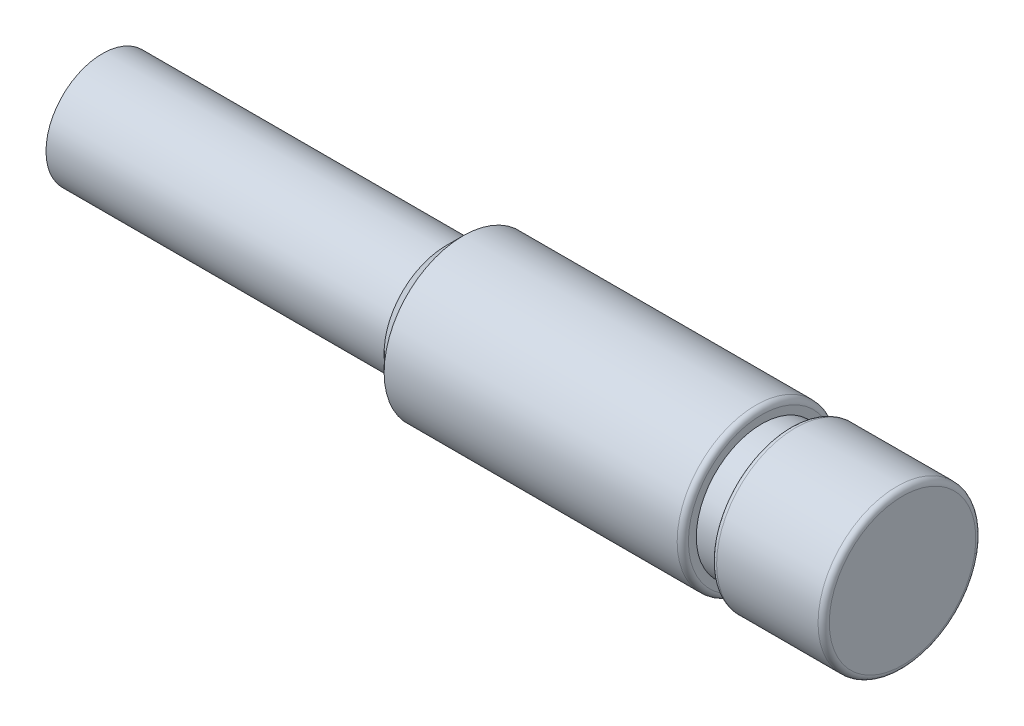
ISO-10303-21;
HEADER;
FILE_DESCRIPTION(('STEP AP214'),'2;1');
FILE_NAME('part.step','',(''),(''),'','','');
FILE_SCHEMA(('AUTOMOTIVE_DESIGN { 1 0 10303 214 1 1 1 1 }'));
ENDSEC;
DATA;
#1=APPLICATION_CONTEXT('core data for automotive mechanical design processes');
#2=APPLICATION_PROTOCOL_DEFINITION('international standard','automotive_design',2000,#1);
#3=PRODUCT_CONTEXT('',#1,'mechanical');
#4=PRODUCT('Part','Part','',(#3));
#5=PRODUCT_RELATED_PRODUCT_CATEGORY('part','',(#4));
#6=PRODUCT_DEFINITION_FORMATION('','',#4);
#7=PRODUCT_DEFINITION_CONTEXT('part definition',#1,'design');
#8=PRODUCT_DEFINITION('design','',#6,#7);
#9=PRODUCT_DEFINITION_SHAPE('','',#8);
#10=(LENGTH_UNIT() NAMED_UNIT(*) SI_UNIT(.MILLI.,.METRE.));
#11=(NAMED_UNIT(*) PLANE_ANGLE_UNIT() SI_UNIT($,.RADIAN.));
#12=(NAMED_UNIT(*) SI_UNIT($,.STERADIAN.) SOLID_ANGLE_UNIT());
#13=UNCERTAINTY_MEASURE_WITH_UNIT(LENGTH_MEASURE(1.E-05),#10,'distance_accuracy_value','');
#14=(GEOMETRIC_REPRESENTATION_CONTEXT(3) GLOBAL_UNCERTAINTY_ASSIGNED_CONTEXT((#13)) GLOBAL_UNIT_ASSIGNED_CONTEXT((#10,
#11,#12)) REPRESENTATION_CONTEXT('',''));
#15=CARTESIAN_POINT('',(0.,0.,0.));
#16=DIRECTION('',(0.,0.,1.));
#17=DIRECTION('',(1.,0.,0.));
#18=AXIS2_PLACEMENT_3D('',#15,#16,#17);
#19=CARTESIAN_POINT('',(0.,5.,0.));
#20=DIRECTION('',(1.,0.,0.));
#21=DIRECTION('',(0.,0.,-1.));
#22=AXIS2_PLACEMENT_3D('',#19,#20,#21);
#23=PLANE('',#22);
#24=CARTESIAN_POINT('',(0.,0.,0.));
#25=DIRECTION('',(1.,0.,0.));
#26=DIRECTION('',(0.,0.,-1.));
#27=AXIS2_PLACEMENT_3D('',#24,#25,#26);
#28=CIRCLE('',#27,4.50000000000001);
#29=CARTESIAN_POINT('',(0.,0.,-4.50000000000001));
#30=VERTEX_POINT('',#29);
#31=EDGE_CURVE('E66',#30,#30,#28,.T.);
#32=ORIENTED_EDGE('',*,*,#31,.T.);
#33=EDGE_LOOP('',(#32));
#34=FACE_BOUND('',#33,.T.);
#35=CARTESIAN_POINT('',(0.,0.,0.));
#36=DIRECTION('',(-1.,0.,0.));
#37=DIRECTION('',(0.,0.,1.));
#38=AXIS2_PLACEMENT_3D('',#35,#36,#37);
#39=CIRCLE('',#38,5.);
#40=CARTESIAN_POINT('',(0.,0.,5.));
#41=VERTEX_POINT('',#40);
#42=EDGE_CURVE('E81',#41,#41,#39,.T.);
#43=ORIENTED_EDGE('',*,*,#42,.T.);
#44=EDGE_LOOP('',(#43));
#45=FACE_BOUND('',#44,.T.);
#46=ADVANCED_FACE('F34',(#34,#45),#23,.F.);
#47=CARTESIAN_POINT('',(71.,0.,0.));
#48=DIRECTION('',(-1.,0.,0.));
#49=DIRECTION('',(0.,0.,1.));
#50=AXIS2_PLACEMENT_3D('',#47,#48,#49);
#51=PLANE('',#50);
#52=CARTESIAN_POINT('',(71.,0.,0.));
#53=DIRECTION('',(-1.,0.,0.));
#54=DIRECTION('',(0.,0.,1.));
#55=AXIS2_PLACEMENT_3D('',#52,#53,#54);
#56=CIRCLE('',#55,6.5);
#57=CARTESIAN_POINT('',(71.,0.,6.5));
#58=VERTEX_POINT('',#57);
#59=EDGE_CURVE('E41',#58,#58,#56,.F.);
#60=ORIENTED_EDGE('',*,*,#59,.T.);
#61=EDGE_LOOP('',(#60));
#62=FACE_BOUND('',#61,.T.);
#63=ADVANCED_FACE('F105',(#62),#51,.F.);
#64=CARTESIAN_POINT('',(0.,0.,0.));
#65=DIRECTION('',(-1.,0.,0.));
#66=DIRECTION('',(0.,0.,1.));
#67=AXIS2_PLACEMENT_3D('',#64,#65,#66);
#68=CYLINDRICAL_SURFACE('',#67,7.);
#69=CARTESIAN_POINT('',(70.5,0.,0.));
#70=DIRECTION('',(-1.,0.,0.));
#71=DIRECTION('',(0.,0.,1.));
#72=AXIS2_PLACEMENT_3D('',#69,#70,#71);
#73=CIRCLE('',#72,7.);
#74=CARTESIAN_POINT('',(70.5,0.,7.));
#75=VERTEX_POINT('',#74);
#76=EDGE_CURVE('E45',#75,#75,#73,.T.);
#77=ORIENTED_EDGE('',*,*,#76,.T.);
#78=EDGE_LOOP('',(#77));
#79=FACE_BOUND('',#78,.T.);
#80=CARTESIAN_POINT('',(61.5,0.,0.));
#81=DIRECTION('',(1.,0.,0.));
#82=DIRECTION('',(0.,0.,-1.));
#83=AXIS2_PLACEMENT_3D('',#80,#81,#82);
#84=CIRCLE('',#83,7.);
#85=CARTESIAN_POINT('',(61.5,0.,-7.));
#86=VERTEX_POINT('',#85);
#87=EDGE_CURVE('E49',#86,#86,#84,.T.);
#88=ORIENTED_EDGE('',*,*,#87,.T.);
#89=EDGE_LOOP('',(#88));
#90=FACE_BOUND('',#89,.T.);
#91=ADVANCED_FACE('F111',(#79,#90),#68,.T.);
#92=CARTESIAN_POINT('',(61.,7.,0.));
#93=DIRECTION('',(1.,0.,0.));
#94=DIRECTION('',(0.,0.,-1.));
#95=AXIS2_PLACEMENT_3D('',#92,#93,#94);
#96=PLANE('',#95);
#97=CARTESIAN_POINT('',(61.,0.,0.));
#98=DIRECTION('',(1.,0.,0.));
#99=DIRECTION('',(0.,0.,-1.));
#100=AXIS2_PLACEMENT_3D('',#97,#98,#99);
#101=CIRCLE('',#100,6.5);
#102=CARTESIAN_POINT('',(61.,0.,-6.5));
#103=VERTEX_POINT('',#102);
#104=EDGE_CURVE('E10',#103,#103,#101,.F.);
#105=ORIENTED_EDGE('',*,*,#104,.T.);
#106=EDGE_LOOP('',(#105));
#107=FACE_BOUND('',#106,.T.);
#108=CARTESIAN_POINT('',(61.,0.,0.));
#109=DIRECTION('',(-1.,0.,0.));
#110=DIRECTION('',(0.,0.,1.));
#111=AXIS2_PLACEMENT_3D('',#108,#109,#110);
#112=CIRCLE('',#111,5.8);
#113=CARTESIAN_POINT('',(61.,0.,5.8));
#114=VERTEX_POINT('',#113);
#115=EDGE_CURVE('E72',#114,#114,#112,.T.);
#116=ORIENTED_EDGE('',*,*,#115,.F.);
#117=EDGE_LOOP('',(#116));
#118=FACE_BOUND('',#117,.T.);
#119=ADVANCED_FACE('F138',(#107,#118),#96,.F.);
#120=CARTESIAN_POINT('',(0.,0.,0.));
#121=DIRECTION('',(-1.,0.,0.));
#122=DIRECTION('',(0.,0.,1.));
#123=AXIS2_PLACEMENT_3D('',#120,#121,#122);
#124=CYLINDRICAL_SURFACE('',#123,5.8);
#125=CARTESIAN_POINT('',(58.5,0.,0.));
#126=DIRECTION('',(-1.,0.,0.));
#127=DIRECTION('',(0.,0.,1.));
#128=AXIS2_PLACEMENT_3D('',#125,#126,#127);
#129=CIRCLE('',#128,5.8);
#130=CARTESIAN_POINT('',(58.5,0.,5.8));
#131=VERTEX_POINT('',#130);
#132=EDGE_CURVE('E75',#131,#131,#129,.T.);
#133=ORIENTED_EDGE('',*,*,#132,.F.);
#134=EDGE_LOOP('',(#133));
#135=FACE_BOUND('',#134,.T.);
#136=ORIENTED_EDGE('',*,*,#115,.T.);
#137=EDGE_LOOP('',(#136));
#138=FACE_BOUND('',#137,.T.);
#139=ADVANCED_FACE('F144',(#135,#138),#124,.T.);
#140=CARTESIAN_POINT('',(58.5,5.8,0.));
#141=DIRECTION('',(-1.,0.,0.));
#142=DIRECTION('',(0.,0.,1.));
#143=AXIS2_PLACEMENT_3D('',#140,#141,#142);
#144=PLANE('',#143);
#145=CARTESIAN_POINT('',(58.5,0.,0.));
#146=DIRECTION('',(-1.,0.,0.));
#147=DIRECTION('',(0.,0.,1.));
#148=AXIS2_PLACEMENT_3D('',#145,#146,#147);
#149=CIRCLE('',#148,6.49999999999999);
#150=CARTESIAN_POINT('',(58.5,0.,6.49999999999999));
#151=VERTEX_POINT('',#150);
#152=EDGE_CURVE('E54',#151,#151,#149,.F.);
#153=ORIENTED_EDGE('',*,*,#152,.T.);
#154=EDGE_LOOP('',(#153));
#155=FACE_BOUND('',#154,.T.);
#156=ORIENTED_EDGE('',*,*,#132,.T.);
#157=EDGE_LOOP('',(#156));
#158=FACE_BOUND('',#157,.T.);
#159=ADVANCED_FACE('F149',(#155,#158),#144,.F.);
#160=CARTESIAN_POINT('',(0.,0.,0.));
#161=DIRECTION('',(-1.,0.,0.));
#162=DIRECTION('',(0.,0.,1.));
#163=AXIS2_PLACEMENT_3D('',#160,#161,#162);
#164=CYLINDRICAL_SURFACE('',#163,6.99999999999999);
#165=CARTESIAN_POINT('',(58.,0.,0.));
#166=DIRECTION('',(-1.,0.,0.));
#167=DIRECTION('',(0.,0.,1.));
#168=AXIS2_PLACEMENT_3D('',#165,#166,#167);
#169=CIRCLE('',#168,6.99999999999999);
#170=CARTESIAN_POINT('',(58.,0.,6.99999999999999));
#171=VERTEX_POINT('',#170);
#172=EDGE_CURVE('E57',#171,#171,#169,.T.);
#173=ORIENTED_EDGE('',*,*,#172,.T.);
#174=EDGE_LOOP('',(#173));
#175=FACE_BOUND('',#174,.T.);
#176=CARTESIAN_POINT('',(32.,0.,0.));
#177=DIRECTION('',(1.,0.,0.));
#178=DIRECTION('',(0.,0.,-1.));
#179=AXIS2_PLACEMENT_3D('',#176,#177,#178);
#180=CIRCLE('',#179,6.99999999999999);
#181=CARTESIAN_POINT('',(32.,0.,-6.99999999999999));
#182=VERTEX_POINT('',#181);
#183=EDGE_CURVE('E60',#182,#182,#180,.T.);
#184=ORIENTED_EDGE('',*,*,#183,.T.);
#185=EDGE_LOOP('',(#184));
#186=FACE_BOUND('',#185,.T.);
#187=ADVANCED_FACE('F153',(#175,#186),#164,.T.);
#188=CARTESIAN_POINT('',(30.5,6.99999999999999,0.));
#189=DIRECTION('',(1.,0.,0.));
#190=DIRECTION('',(0.,0.,-1.));
#191=AXIS2_PLACEMENT_3D('',#188,#189,#190);
#192=PLANE('',#191);
#193=CARTESIAN_POINT('',(30.5,0.,0.));
#194=DIRECTION('',(1.,0.,0.));
#195=DIRECTION('',(0.,0.,-1.));
#196=AXIS2_PLACEMENT_3D('',#193,#194,#195);
#197=CIRCLE('',#196,5.49999999999999);
#198=CARTESIAN_POINT('',(30.5,0.,-5.49999999999999));
#199=VERTEX_POINT('',#198);
#200=EDGE_CURVE('E63',#199,#199,#197,.F.);
#201=ORIENTED_EDGE('',*,*,#200,.T.);
#202=EDGE_LOOP('',(#201));
#203=FACE_BOUND('',#202,.T.);
#204=CARTESIAN_POINT('',(30.5,0.,0.));
#205=DIRECTION('',(-1.,0.,0.));
#206=DIRECTION('',(0.,0.,1.));
#207=AXIS2_PLACEMENT_3D('',#204,#205,#206);
#208=CIRCLE('',#207,5.);
#209=CARTESIAN_POINT('',(30.5,0.,5.));
#210=VERTEX_POINT('',#209);
#211=EDGE_CURVE('E78',#210,#210,#208,.T.);
#212=ORIENTED_EDGE('',*,*,#211,.F.);
#213=EDGE_LOOP('',(#212));
#214=FACE_BOUND('',#213,.T.);
#215=ADVANCED_FACE('F101',(#203,#214),#192,.F.);
#216=CARTESIAN_POINT('',(0.,0.,0.));
#217=DIRECTION('',(-1.,0.,0.));
#218=DIRECTION('',(0.,0.,1.));
#219=AXIS2_PLACEMENT_3D('',#216,#217,#218);
#220=CYLINDRICAL_SURFACE('',#219,5.);
#221=ORIENTED_EDGE('',*,*,#42,.F.);
#222=EDGE_LOOP('',(#221));
#223=FACE_BOUND('',#222,.T.);
#224=ORIENTED_EDGE('',*,*,#211,.T.);
#225=EDGE_LOOP('',(#224));
#226=FACE_BOUND('',#225,.T.);
#227=ADVANCED_FACE('F92',(#223,#226),#220,.T.);
#228=CARTESIAN_POINT('',(3.6,0.,0.));
#229=DIRECTION('',(-1.,0.,0.));
#230=DIRECTION('',(0.,0.,1.));
#231=AXIS2_PLACEMENT_3D('',#228,#229,#230);
#232=CYLINDRICAL_SURFACE('',#231,3.);
#233=CARTESIAN_POINT('',(3.21676038076436,0.,0.));
#234=DIRECTION('',(1.,0.,0.));
#235=DIRECTION('',(0.,0.,-1.));
#236=AXIS2_PLACEMENT_3D('',#233,#234,#235);
#237=CIRCLE('',#236,3.);
#238=CARTESIAN_POINT('',(3.21676038076436,0.,-3.));
#239=VERTEX_POINT('',#238);
#240=EDGE_CURVE('E69',#239,#239,#237,.F.);
#241=ORIENTED_EDGE('',*,*,#240,.T.);
#242=EDGE_LOOP('',(#241));
#243=FACE_BOUND('',#242,.T.);
#244=CARTESIAN_POINT('',(3.6,0.,0.));
#245=DIRECTION('',(-1.,0.,0.));
#246=DIRECTION('',(0.,0.,1.));
#247=AXIS2_PLACEMENT_3D('',#244,#245,#246);
#248=CIRCLE('',#247,3.);
#249=CARTESIAN_POINT('',(3.6,0.,3.));
#250=VERTEX_POINT('',#249);
#251=EDGE_CURVE('E84',#250,#250,#248,.T.);
#252=ORIENTED_EDGE('',*,*,#251,.F.);
#253=EDGE_LOOP('',(#252));
#254=FACE_BOUND('',#253,.T.);
#255=ADVANCED_FACE('F90',(#243,#254),#232,.F.);
#256=CARTESIAN_POINT('',(3.6,0.,0.));
#257=DIRECTION('',(-1.,0.,0.));
#258=DIRECTION('',(0.,0.,1.));
#259=AXIS2_PLACEMENT_3D('',#256,#257,#258);
#260=PLANE('',#259);
#261=ORIENTED_EDGE('',*,*,#251,.T.);
#262=EDGE_LOOP('',(#261));
#263=FACE_BOUND('',#262,.T.);
#264=ADVANCED_FACE('F88',(#263),#260,.T.);
#265=CARTESIAN_POINT('',(3.21676038076436,0.,0.));
#266=DIRECTION('',(-1.,0.,0.));
#267=DIRECTION('',(0.,0.,1.));
#268=AXIS2_PLACEMENT_3D('',#265,#266,#267);
#269=CONICAL_SURFACE('',#268,3.,0.436332312998583);
#270=ORIENTED_EDGE('',*,*,#31,.F.);
#271=EDGE_LOOP('',(#270));
#272=FACE_BOUND('',#271,.T.);
#273=ORIENTED_EDGE('',*,*,#240,.F.);
#274=EDGE_LOOP('',(#273));
#275=FACE_BOUND('',#274,.T.);
#276=ADVANCED_FACE('F99',(#272,#275),#269,.F.);
#277=CARTESIAN_POINT('',(30.5,0.,0.));
#278=DIRECTION('',(1.,0.,0.));
#279=DIRECTION('',(0.,0.,-1.));
#280=AXIS2_PLACEMENT_3D('',#277,#278,#279);
#281=CONICAL_SURFACE('',#280,5.49999999999999,0.78539816339745);
#282=ORIENTED_EDGE('',*,*,#183,.F.);
#283=EDGE_LOOP('',(#282));
#284=FACE_BOUND('',#283,.T.);
#285=ORIENTED_EDGE('',*,*,#200,.F.);
#286=EDGE_LOOP('',(#285));
#287=FACE_BOUND('',#286,.T.);
#288=ADVANCED_FACE('F118',(#284,#287),#281,.T.);
#289=CARTESIAN_POINT('',(58.,0.,0.));
#290=DIRECTION('',(-1.,0.,0.));
#291=DIRECTION('',(0.,0.,1.));
#292=AXIS2_PLACEMENT_3D('',#289,#290,#291);
#293=TOROIDAL_SURFACE('',#292,6.49999999999999,0.5);
#294=ORIENTED_EDGE('',*,*,#152,.F.);
#295=EDGE_LOOP('',(#294));
#296=FACE_BOUND('',#295,.T.);
#297=ORIENTED_EDGE('',*,*,#172,.F.);
#298=EDGE_LOOP('',(#297));
#299=FACE_BOUND('',#298,.T.);
#300=ADVANCED_FACE('F122',(#296,#299),#293,.T.);
#301=CARTESIAN_POINT('',(70.5,0.,0.));
#302=DIRECTION('',(-1.,0.,0.));
#303=DIRECTION('',(0.,0.,1.));
#304=AXIS2_PLACEMENT_3D('',#301,#302,#303);
#305=TOROIDAL_SURFACE('',#304,6.5,0.5);
#306=ORIENTED_EDGE('',*,*,#59,.F.);
#307=EDGE_LOOP('',(#306));
#308=FACE_BOUND('',#307,.T.);
#309=ORIENTED_EDGE('',*,*,#76,.F.);
#310=EDGE_LOOP('',(#309));
#311=FACE_BOUND('',#310,.T.);
#312=ADVANCED_FACE('F125',(#308,#311),#305,.T.);
#313=CARTESIAN_POINT('',(61.5,0.,0.));
#314=DIRECTION('',(1.,0.,0.));
#315=DIRECTION('',(0.,0.,-1.));
#316=AXIS2_PLACEMENT_3D('',#313,#314,#315);
#317=TOROIDAL_SURFACE('',#316,6.5,0.5);
#318=ORIENTED_EDGE('',*,*,#87,.F.);
#319=EDGE_LOOP('',(#318));
#320=FACE_BOUND('',#319,.T.);
#321=ORIENTED_EDGE('',*,*,#104,.F.);
#322=EDGE_LOOP('',(#321));
#323=FACE_BOUND('',#322,.T.);
#324=ADVANCED_FACE('F36',(#320,#323),#317,.T.);
#325=CLOSED_SHELL('',(#46,#63,#91,#119,#139,#159,#187,#215,#227,#255,#264,#276,#288,#300,#312,#324));
#326=MANIFOLD_SOLID_BREP('B2',#325);
#327=ADVANCED_BREP_SHAPE_REPRESENTATION('',(#18,#326),#14);
#328=SHAPE_DEFINITION_REPRESENTATION(#9,#327);
ENDSEC;
END-ISO-10303-21;
